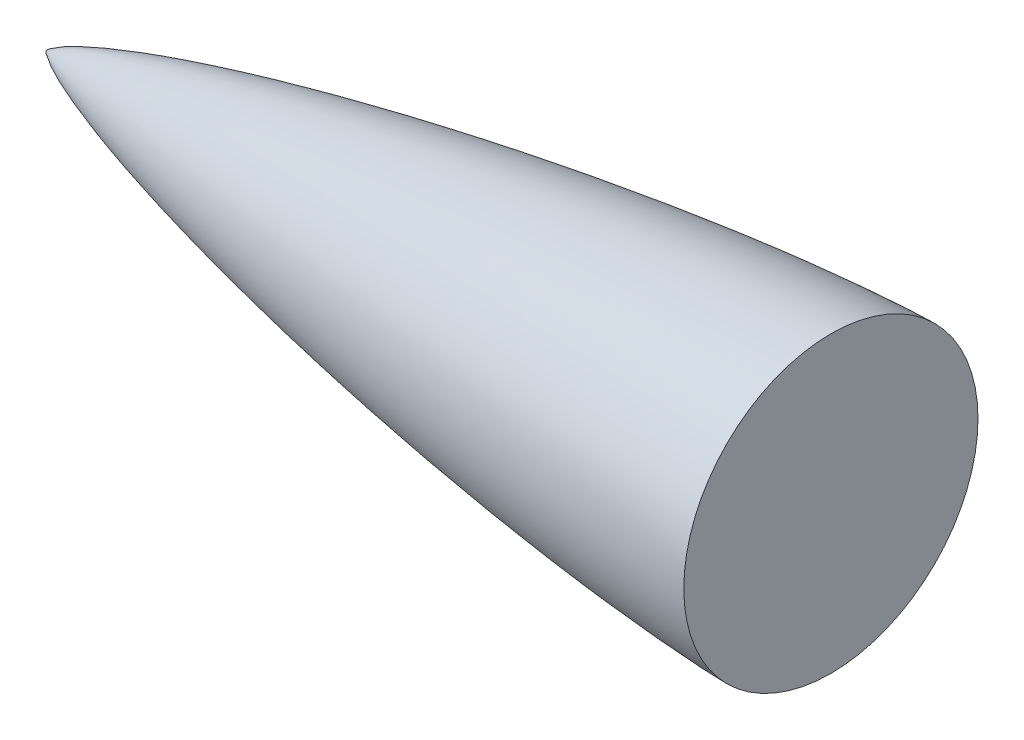
ISO-10303-21;
HEADER;
FILE_DESCRIPTION(('STEP AP214'),'2;1');
FILE_NAME('part.step','',(''),(''),'','','');
FILE_SCHEMA(('AUTOMOTIVE_DESIGN { 1 0 10303 214 1 1 1 1 }'));
ENDSEC;
DATA;
#1=APPLICATION_CONTEXT('core data for automotive mechanical design processes');
#2=APPLICATION_PROTOCOL_DEFINITION('international standard','automotive_design',2000,#1);
#3=PRODUCT_CONTEXT('',#1,'mechanical');
#4=PRODUCT('Part','Part','',(#3));
#5=PRODUCT_RELATED_PRODUCT_CATEGORY('part','',(#4));
#6=PRODUCT_DEFINITION_FORMATION('','',#4);
#7=PRODUCT_DEFINITION_CONTEXT('part definition',#1,'design');
#8=PRODUCT_DEFINITION('design','',#6,#7);
#9=PRODUCT_DEFINITION_SHAPE('','',#8);
#10=(LENGTH_UNIT() NAMED_UNIT(*) SI_UNIT(.MILLI.,.METRE.));
#11=(NAMED_UNIT(*) PLANE_ANGLE_UNIT() SI_UNIT($,.RADIAN.));
#12=(NAMED_UNIT(*) SI_UNIT($,.STERADIAN.) SOLID_ANGLE_UNIT());
#13=UNCERTAINTY_MEASURE_WITH_UNIT(LENGTH_MEASURE(1.E-05),#10,'distance_accuracy_value','');
#14=(GEOMETRIC_REPRESENTATION_CONTEXT(3) GLOBAL_UNCERTAINTY_ASSIGNED_CONTEXT((#13)) GLOBAL_UNIT_ASSIGNED_CONTEXT((#10,
#11,#12)) REPRESENTATION_CONTEXT('',''));
#15=CARTESIAN_POINT('',(0.,0.,0.));
#16=DIRECTION('',(0.,0.,1.));
#17=DIRECTION('',(1.,0.,0.));
#18=AXIS2_PLACEMENT_3D('',#15,#16,#17);
#19=CARTESIAN_POINT('',(15.9999999999956,3.00000000002365,0.));
#20=CARTESIAN_POINT('',(15.8207005079091,2.99847720768331,0.));
#21=CARTESIAN_POINT('',(15.3844542384263,2.98402713477333,0.));
#22=CARTESIAN_POINT('',(14.6918762784278,2.94587174183128,0.));
#23=CARTESIAN_POINT('',(13.743967801102,2.87211397896197,0.));
#24=CARTESIAN_POINT('',(12.7201456380598,2.77337556067058,0.));
#25=CARTESIAN_POINT('',(11.6980202134153,2.65840338589061,0.));
#26=CARTESIAN_POINT('',(10.6776325652456,2.52900871991855,0.));
#27=CARTESIAN_POINT('',(9.65906233817788,2.38599985818704,0.));
#28=CARTESIAN_POINT('',(8.38826992004452,2.190799150425,0.));
#29=CARTESIAN_POINT('',(7.12100108030111,1.97360429245703,0.));
#30=CARTESIAN_POINT('',(5.8578448860294,1.73351515420829,0.));
#31=CARTESIAN_POINT('',(4.60004411195039,1.46700565606728,0.));
#32=CARTESIAN_POINT('',(3.59783739971793,1.23552593950822,0.));
#33=CARTESIAN_POINT('',(2.62585136714204,0.98820076508268,0.));
#34=CARTESIAN_POINT('',(1.78498820442536,0.748243125158098,0.));
#35=CARTESIAN_POINT('',(1.11652562893244,0.53110726642254,0.));
#36=CARTESIAN_POINT('',(0.652230491472677,0.356312125063612,0.));
#37=CARTESIAN_POINT('',(0.38256896413376,0.239626476375545,0.));
#38=CARTESIAN_POINT('',(0.219554775795816,0.158217083373728,0.));
#39=CARTESIAN_POINT('',(0.127040022285215,0.104971537648494,0.));
#40=CARTESIAN_POINT('',(0.0748237281249637,0.0705491147327083,0.));
#41=CARTESIAN_POINT('',(0.0450078813305577,0.0481701671838642,0.));
#42=CARTESIAN_POINT('',(0.0278028395108039,0.0335259658054608,0.));
#43=CARTESIAN_POINT('',(0.0168947534382416,0.0231315924685644,0.));
#44=CARTESIAN_POINT('',(0.00886195613149423,0.0143110235487454,0.));
#45=CARTESIAN_POINT('',(0.00371293614268931,0.00804445098543345,0.));
#46=CARTESIAN_POINT('',(0.00108511686631914,0.00302766691870782,0.));
#47=CARTESIAN_POINT('',(0.,0.,0.));
#48=B_SPLINE_CURVE_WITH_KNOTS('',4,(#19,#20,#21,#22,#23,#24,#25,#26,#27,#28,#29,#30,#31,#32,#33,
#34,#35,#36,#37,#38,#39,#40,#41,#42,#43,#44,#45,#46,#47),.UNSPECIFIED.,.F.,.F.,(5,1,1,1,1,1,1,1,
1,1,1,1,1,1,1,1,1,1,1,1,1,1,1,1,1,5),(0.,0.0438124180261164,0.106643577645774,0.169474739222379,
0.232305901401562,0.295137063350153,0.357968225083856,0.420799387797289,0.483630551217843,
0.609292872502455,0.672124036319494,0.734955195594604,0.797786349950526,0.860617504772249,
0.917173203404501,0.948588742126172,0.969474614318481,0.981802657873222,0.988938866633724,
0.993090028718186,0.995541937926441,0.997077059288944,0.998041245159108,0.998610352098517,
0.999217214762644,1.),.UNSPECIFIED.);
#49=CARTESIAN_POINT('',(0.,0.,0.));
#50=DIRECTION('',(-1.,0.,0.));
#51=AXIS1_PLACEMENT('',#49,#50);
#52=SURFACE_OF_REVOLUTION('',#48,#51);
#53=CARTESIAN_POINT('',(0.,0.,0.));
#54=VERTEX_POINT('',#53);
#55=VERTEX_LOOP('',#54);
#56=FACE_BOUND('',#55,.T.);
#57=CARTESIAN_POINT('',(15.9999999999956,0.,0.));
#58=DIRECTION('',(-1.,0.,0.));
#59=DIRECTION('',(0.,0.,1.));
#60=AXIS2_PLACEMENT_3D('',#57,#58,#59);
#61=CIRCLE('',#60,3.00000000002365);
#62=CARTESIAN_POINT('',(15.9999999999956,0.,3.00000000002365));
#63=VERTEX_POINT('',#62);
#64=EDGE_CURVE('E11',#63,#63,#61,.T.);
#65=ORIENTED_EDGE('',*,*,#64,.T.);
#66=EDGE_LOOP('',(#65));
#67=FACE_BOUND('',#66,.T.);
#68=ADVANCED_FACE('F36',(#56,#67),#52,.T.);
#69=CARTESIAN_POINT('',(15.9999999999956,3.00000000002365,0.));
#70=DIRECTION('',(-1.,0.,0.));
#71=DIRECTION('',(0.,0.,1.));
#72=AXIS2_PLACEMENT_3D('',#69,#70,#71);
#73=PLANE('',#72);
#74=ORIENTED_EDGE('',*,*,#64,.F.);
#75=EDGE_LOOP('',(#74));
#76=FACE_BOUND('',#75,.T.);
#77=ADVANCED_FACE('F46',(#76),#73,.F.);
#78=CLOSED_SHELL('',(#68,#77));
#79=MANIFOLD_SOLID_BREP('B2',#78);
#80=ADVANCED_BREP_SHAPE_REPRESENTATION('',(#18,#79),#14);
#81=SHAPE_DEFINITION_REPRESENTATION(#9,#80);
ENDSEC;
END-ISO-10303-21;
